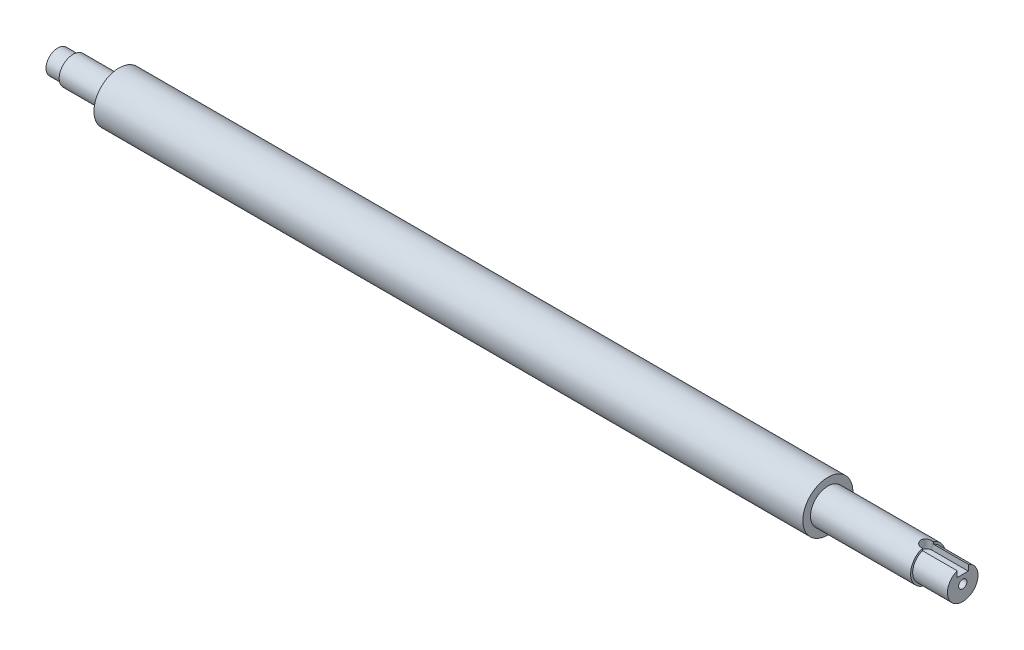
ISO-10303-21;
HEADER;
FILE_DESCRIPTION(('STEP AP214'),'2;1');
FILE_NAME('part.step','',(''),(''),'','','');
FILE_SCHEMA(('AUTOMOTIVE_DESIGN { 1 0 10303 214 1 1 1 1 }'));
ENDSEC;
DATA;
#1=APPLICATION_CONTEXT('core data for automotive mechanical design processes');
#2=APPLICATION_PROTOCOL_DEFINITION('international standard','automotive_design',2000,#1);
#3=PRODUCT_CONTEXT('',#1,'mechanical');
#4=PRODUCT('Part','Part','',(#3));
#5=PRODUCT_RELATED_PRODUCT_CATEGORY('part','',(#4));
#6=PRODUCT_DEFINITION_FORMATION('','',#4);
#7=PRODUCT_DEFINITION_CONTEXT('part definition',#1,'design');
#8=PRODUCT_DEFINITION('design','',#6,#7);
#9=PRODUCT_DEFINITION_SHAPE('','',#8);
#10=(LENGTH_UNIT() NAMED_UNIT(*) SI_UNIT(.MILLI.,.METRE.));
#11=(NAMED_UNIT(*) PLANE_ANGLE_UNIT() SI_UNIT($,.RADIAN.));
#12=(NAMED_UNIT(*) SI_UNIT($,.STERADIAN.) SOLID_ANGLE_UNIT());
#13=UNCERTAINTY_MEASURE_WITH_UNIT(LENGTH_MEASURE(1.E-05),#10,'distance_accuracy_value','');
#14=(GEOMETRIC_REPRESENTATION_CONTEXT(3) GLOBAL_UNCERTAINTY_ASSIGNED_CONTEXT((#13)) GLOBAL_UNIT_ASSIGNED_CONTEXT((#10,
#11,#12)) REPRESENTATION_CONTEXT('',''));
#15=CARTESIAN_POINT('',(0.,0.,0.));
#16=DIRECTION('',(0.,0.,1.));
#17=DIRECTION('',(1.,0.,0.));
#18=AXIS2_PLACEMENT_3D('',#15,#16,#17);
#19=CARTESIAN_POINT('',(254.240699987468,12.5000000000002,0.));
#20=DIRECTION('',(1.,0.,0.));
#21=DIRECTION('',(0.,1.,0.));
#22=AXIS2_PLACEMENT_3D('',#19,#20,#21);
#23=PLANE('',#22);
#24=DIRECTION('',(0.,-1.,0.));
#25=VECTOR('',#24,1.);
#26=CARTESIAN_POINT('',(254.240699987468,12.5000000000002,4.));
#27=LINE('',#26,#25);
#28=CARTESIAN_POINT('',(254.240699987468,11.8427192823272,4.));
#29=VERTEX_POINT('',#28);
#30=CARTESIAN_POINT('',(254.240699987468,10.2469507659598,4.));
#31=VERTEX_POINT('',#30);
#32=EDGE_CURVE('E120',#29,#31,#27,.T.);
#33=ORIENTED_EDGE('',*,*,#32,.F.);
#34=CARTESIAN_POINT('',(254.240699987468,0.,0.));
#35=DIRECTION('',(1.,0.,0.));
#36=DIRECTION('',(0.,1.,0.));
#37=AXIS2_PLACEMENT_3D('',#34,#35,#36);
#38=CIRCLE('',#37,12.5000000000001);
#39=CARTESIAN_POINT('',(254.240699987468,11.8427192823272,-4.));
#40=VERTEX_POINT('',#39);
#41=EDGE_CURVE('E148',#29,#40,#38,.T.);
#42=ORIENTED_EDGE('',*,*,#41,.T.);
#43=DIRECTION('',(0.,1.,0.));
#44=VECTOR('',#43,1.);
#45=CARTESIAN_POINT('',(254.240699987468,12.5000000000002,-4.));
#46=LINE('',#45,#44);
#47=CARTESIAN_POINT('',(254.240699987468,10.2469507659598,-4.));
#48=VERTEX_POINT('',#47);
#49=EDGE_CURVE('E115',#48,#40,#46,.T.);
#50=ORIENTED_EDGE('',*,*,#49,.F.);
#51=CARTESIAN_POINT('',(254.240699987468,0.,0.));
#52=DIRECTION('',(1.,0.,0.));
#53=DIRECTION('',(0.,1.,0.));
#54=AXIS2_PLACEMENT_3D('',#51,#52,#53);
#55=CIRCLE('',#54,11.0000000000001);
#56=EDGE_CURVE('E123',#31,#48,#55,.T.);
#57=ORIENTED_EDGE('',*,*,#56,.F.);
#58=EDGE_LOOP('',(#33,#42,#50,#57));
#59=FACE_BOUND('',#58,.T.);
#60=ADVANCED_FACE('F32',(#59),#23,.T.);
#61=CARTESIAN_POINT('',(279.240699987468,0.,0.));
#62=DIRECTION('',(1.,0.,0.));
#63=DIRECTION('',(0.,1.,0.));
#64=AXIS2_PLACEMENT_3D('',#61,#62,#63);
#65=CYLINDRICAL_SURFACE('',#64,12.5000000000001);
#66=DIRECTION('',(1.,0.,0.));
#67=VECTOR('',#66,1.);
#68=CARTESIAN_POINT('',(279.240699987468,11.8427192823272,4.));
#69=LINE('',#68,#67);
#70=CARTESIAN_POINT('',(253.217727506573,11.8427192823272,4.));
#71=VERTEX_POINT('',#70);
#72=EDGE_CURVE('E58',#71,#29,#69,.T.);
#73=ORIENTED_EDGE('',*,*,#72,.F.);
#74=CARTESIAN_POINT('',(253.217727506573,11.8427192823272,-4.));
#75=CARTESIAN_POINT('',(253.108327734611,11.842702736606,-4.00001410484613));
#76=CARTESIAN_POINT('',(252.998937296725,11.844234805237,-3.995512175201));
#77=CARTESIAN_POINT('',(252.780999265837,11.8502730910576,-3.97758606678449));
#78=CARTESIAN_POINT('',(252.672451468089,11.8547785613245,-3.96416412872571));
#79=CARTESIAN_POINT('',(252.457266475728,11.8666242076311,-3.9285572511943));
#80=CARTESIAN_POINT('',(252.350624810962,11.8739564736693,-3.90639676021451));
#81=CARTESIAN_POINT('',(252.139721868202,11.891216499379,-3.85353581488657));
#82=CARTESIAN_POINT('',(252.035460666416,11.9011443420202,-3.82283508754056));
#83=CARTESIAN_POINT('',(251.727422502295,11.9343840843198,-3.71831764495511));
#84=CARTESIAN_POINT('',(251.528090954505,11.9611699822068,-3.63203544139886));
#85=CARTESIAN_POINT('',(251.146714949531,12.020958395588,-3.42895021192286));
#86=CARTESIAN_POINT('',(250.964680127523,12.0539643457895,-3.31213030924908));
#87=CARTESIAN_POINT('',(250.616473517974,12.1237984078072,-3.04678507884789));
#88=CARTESIAN_POINT('',(250.451009182234,12.1607158548653,-2.89735303896513));
#89=CARTESIAN_POINT('',(250.147012657984,12.2334561140968,-2.57296449846115));
#90=CARTESIAN_POINT('',(250.008485158215,12.2692787347871,-2.39800356343232));
#91=CARTESIAN_POINT('',(249.759112308203,12.3368244653947,-2.02237003010512));
#92=CARTESIAN_POINT('',(249.649005550104,12.3684294972005,-1.82118394546976));
#93=CARTESIAN_POINT('',(249.464478011224,12.4229251649939,-1.40197197350369));
#94=CARTESIAN_POINT('',(249.390047032791,12.4458182908279,-1.18395091903582));
#95=CARTESIAN_POINT('',(249.281368642323,12.4796767811418,-0.744713961063375));
#96=CARTESIAN_POINT('',(249.245902573193,12.491003049934,-0.523827920101165));
#97=CARTESIAN_POINT('',(249.212294707531,12.5017287122875,-0.0789648151746442));
#98=CARTESIAN_POINT('',(249.214144773048,12.5011307063105,0.145011564197637));
#99=CARTESIAN_POINT('',(249.254326335844,12.488323667336,0.581094974437689));
#100=CARTESIAN_POINT('',(249.291335274552,12.476535580041,0.793338226675238));
#101=CARTESIAN_POINT('',(249.398608058179,12.4431945789582,1.2084232001272));
#102=CARTESIAN_POINT('',(249.468873714006,12.4216411334263,1.41126440871778));
#103=CARTESIAN_POINT('',(249.641485348809,12.3706364987477,1.80478548808182));
#104=CARTESIAN_POINT('',(249.744224026442,12.3410893067349,1.99528012693525));
#105=CARTESIAN_POINT('',(249.978556555618,12.2771965403046,2.35673113106227));
#106=CARTESIAN_POINT('',(250.110157712976,12.2428497517894,2.52768253275748));
#107=CARTESIAN_POINT('',(250.405174037865,12.1712409097158,2.85304511528218));
#108=CARTESIAN_POINT('',(250.569724209165,12.1339170352571,3.00641313381734));
#109=CARTESIAN_POINT('',(250.922699406658,12.0618172896258,3.28377291775699));
#110=CARTESIAN_POINT('',(251.111131765405,12.0270422062067,3.40775562728565));
#111=CARTESIAN_POINT('',(251.409098744322,11.9796198433083,3.56958208232607));
#112=CARTESIAN_POINT('',(251.511726565815,11.9645161845074,3.61975674493765));
#113=CARTESIAN_POINT('',(251.721132259325,11.9364591580625,3.71123075156255));
#114=CARTESIAN_POINT('',(251.82790839436,11.9235049021448,3.75253376401033));
#115=CARTESIAN_POINT('',(252.044740834465,11.9001802342951,3.82585831579177));
#116=CARTESIAN_POINT('',(252.154793484546,11.8898070557592,3.85788979915528));
#117=CARTESIAN_POINT('',(252.377422663521,11.8719756673205,3.91241790563964));
#118=CARTESIAN_POINT('',(252.489998010371,11.8645161211933,3.93491889994975));
#119=CARTESIAN_POINT('',(252.704966752434,11.8533815888389,3.96832908530803));
#120=CARTESIAN_POINT('',(252.807194922368,11.8493925948397,3.9802038456482));
#121=CARTESIAN_POINT('',(253.012188584606,11.8440568016294,3.99603937127681));
#122=CARTESIAN_POINT('',(253.114953144854,11.8427063770565,4.00001099551563));
#123=CARTESIAN_POINT('',(253.217727506573,11.8427192823272,4.));
#124=B_SPLINE_CURVE_WITH_KNOTS('',3,(#74,#75,#76,#77,#78,#79,#80,#81,#82,#83,#84,#85,#86,#87,
#88,#89,#90,#91,#92,#93,#94,#95,#96,#97,#98,#99,#100,#101,#102,#103,#104,#105,#106,#107,#108,
#109,#110,#111,#112,#113,#114,#115,#116,#117,#118,#119,#120,#121,#122,#123),.UNSPECIFIED.,.F.,
.F.,(4,2,2,2,2,2,2,2,2,2,2,2,2,2,2,2,2,2,2,2,2,2,2,2,4),(0.,0.328080176984111,0.656077971124907,
0.98316453936824,1.31026156448799,1.96355293984256,2.61720612481383,3.29209427898758,
3.96709980211697,4.65819584662372,5.34909422856991,6.01770820975084,6.68617638029993,
7.33045501553829,7.97476873730064,8.62719320105808,9.27978300073404,9.96076419384892,
10.6419549776068,10.9872862883783,11.3324745283028,11.6772911585125,12.0219494657669,
12.3305938648258,12.6388138912331),.UNSPECIFIED.);
#125=CARTESIAN_POINT('',(253.217727506573,11.8427192823272,-4.));
#126=VERTEX_POINT('',#125);
#127=EDGE_CURVE('E11',#126,#71,#124,.T.);
#128=ORIENTED_EDGE('',*,*,#127,.F.);
#129=DIRECTION('',(1.,0.,0.));
#130=VECTOR('',#129,1.);
#131=CARTESIAN_POINT('',(279.240699987468,11.8427192823272,-4.));
#132=LINE('',#131,#130);
#133=EDGE_CURVE('E117',#40,#126,#132,.F.);
#134=ORIENTED_EDGE('',*,*,#133,.F.);
#135=ORIENTED_EDGE('',*,*,#41,.F.);
#136=EDGE_LOOP('',(#73,#128,#134,#135));
#137=FACE_BOUND('',#136,.T.);
#138=CARTESIAN_POINT('',(182.240699987468,0.,0.));
#139=DIRECTION('',(1.,0.,0.));
#140=DIRECTION('',(0.,1.,0.));
#141=AXIS2_PLACEMENT_3D('',#138,#139,#140);
#142=CIRCLE('',#141,12.5000000000002);
#143=CARTESIAN_POINT('',(182.240699987468,12.5000000000002,0.));
#144=VERTEX_POINT('',#143);
#145=EDGE_CURVE('E145',#144,#144,#142,.T.);
#146=ORIENTED_EDGE('',*,*,#145,.T.);
#147=EDGE_LOOP('',(#146));
#148=FACE_BOUND('',#147,.T.);
#149=ADVANCED_FACE('F164',(#137,#148),#65,.T.);
#150=CARTESIAN_POINT('',(182.240699987468,18.,0.));
#151=DIRECTION('',(1.,0.,0.));
#152=DIRECTION('',(0.,1.,0.));
#153=AXIS2_PLACEMENT_3D('',#150,#151,#152);
#154=PLANE('',#153);
#155=CARTESIAN_POINT('',(182.240699987468,0.,0.));
#156=DIRECTION('',(1.,0.,0.));
#157=DIRECTION('',(0.,1.,0.));
#158=AXIS2_PLACEMENT_3D('',#155,#156,#157);
#159=CIRCLE('',#158,18.);
#160=CARTESIAN_POINT('',(182.240699987468,18.,0.));
#161=VERTEX_POINT('',#160);
#162=EDGE_CURVE('E142',#161,#161,#159,.T.);
#163=ORIENTED_EDGE('',*,*,#162,.T.);
#164=EDGE_LOOP('',(#163));
#165=FACE_BOUND('',#164,.T.);
#166=ORIENTED_EDGE('',*,*,#145,.F.);
#167=EDGE_LOOP('',(#166));
#168=FACE_BOUND('',#167,.T.);
#169=ADVANCED_FACE('F200',(#165,#168),#154,.T.);
#170=CARTESIAN_POINT('',(279.240699987468,0.,0.));
#171=DIRECTION('',(1.,0.,0.));
#172=DIRECTION('',(0.,1.,0.));
#173=AXIS2_PLACEMENT_3D('',#170,#171,#172);
#174=CYLINDRICAL_SURFACE('',#173,18.);
#175=CARTESIAN_POINT('',(-327.759300012532,0.,0.));
#176=DIRECTION('',(1.,0.,0.));
#177=DIRECTION('',(0.,1.,0.));
#178=AXIS2_PLACEMENT_3D('',#175,#176,#177);
#179=CIRCLE('',#178,18.);
#180=CARTESIAN_POINT('',(-327.759300012532,18.,0.));
#181=VERTEX_POINT('',#180);
#182=EDGE_CURVE('E139',#181,#181,#179,.T.);
#183=ORIENTED_EDGE('',*,*,#182,.T.);
#184=EDGE_LOOP('',(#183));
#185=FACE_BOUND('',#184,.T.);
#186=ORIENTED_EDGE('',*,*,#162,.F.);
#187=EDGE_LOOP('',(#186));
#188=FACE_BOUND('',#187,.T.);
#189=ADVANCED_FACE('F204',(#185,#188),#174,.T.);
#190=CARTESIAN_POINT('',(-327.759300012532,18.,0.));
#191=DIRECTION('',(-1.,0.,0.));
#192=DIRECTION('',(0.,-1.,0.));
#193=AXIS2_PLACEMENT_3D('',#190,#191,#192);
#194=PLANE('',#193);
#195=CARTESIAN_POINT('',(-327.759300012532,0.,0.));
#196=DIRECTION('',(1.,0.,0.));
#197=DIRECTION('',(0.,1.,0.));
#198=AXIS2_PLACEMENT_3D('',#195,#196,#197);
#199=CIRCLE('',#198,10.);
#200=CARTESIAN_POINT('',(-327.759300012532,9.99999999999996,0.));
#201=VERTEX_POINT('',#200);
#202=EDGE_CURVE('E136',#201,#201,#199,.T.);
#203=ORIENTED_EDGE('',*,*,#202,.T.);
#204=EDGE_LOOP('',(#203));
#205=FACE_BOUND('',#204,.T.);
#206=ORIENTED_EDGE('',*,*,#182,.F.);
#207=EDGE_LOOP('',(#206));
#208=FACE_BOUND('',#207,.T.);
#209=ADVANCED_FACE('F211',(#205,#208),#194,.T.);
#210=CARTESIAN_POINT('',(279.240699987468,0.,0.));
#211=DIRECTION('',(1.,0.,0.));
#212=DIRECTION('',(0.,1.,0.));
#213=AXIS2_PLACEMENT_3D('',#210,#211,#212);
#214=CYLINDRICAL_SURFACE('',#213,10.);
#215=CARTESIAN_POINT('',(-360.759300012532,0.,0.));
#216=DIRECTION('',(1.,0.,0.));
#217=DIRECTION('',(0.,1.,0.));
#218=AXIS2_PLACEMENT_3D('',#215,#216,#217);
#219=CIRCLE('',#218,10.);
#220=CARTESIAN_POINT('',(-360.759300012532,9.99999999999996,0.));
#221=VERTEX_POINT('',#220);
#222=EDGE_CURVE('E133',#221,#221,#219,.T.);
#223=ORIENTED_EDGE('',*,*,#222,.T.);
#224=EDGE_LOOP('',(#223));
#225=FACE_BOUND('',#224,.T.);
#226=ORIENTED_EDGE('',*,*,#202,.F.);
#227=EDGE_LOOP('',(#226));
#228=FACE_BOUND('',#227,.T.);
#229=ADVANCED_FACE('F215',(#225,#228),#214,.T.);
#230=CARTESIAN_POINT('',(-360.759300012532,9.99999999999996,0.));
#231=DIRECTION('',(-1.,0.,0.));
#232=DIRECTION('',(0.,-1.,0.));
#233=AXIS2_PLACEMENT_3D('',#230,#231,#232);
#234=PLANE('',#233);
#235=CARTESIAN_POINT('',(-360.759300012532,0.,0.));
#236=DIRECTION('',(1.,0.,0.));
#237=DIRECTION('',(0.,1.,0.));
#238=AXIS2_PLACEMENT_3D('',#235,#236,#237);
#239=CIRCLE('',#238,8.5);
#240=CARTESIAN_POINT('',(-360.759300012532,8.49999999999996,0.));
#241=VERTEX_POINT('',#240);
#242=EDGE_CURVE('E130',#241,#241,#239,.T.);
#243=ORIENTED_EDGE('',*,*,#242,.T.);
#244=EDGE_LOOP('',(#243));
#245=FACE_BOUND('',#244,.T.);
#246=ORIENTED_EDGE('',*,*,#222,.F.);
#247=EDGE_LOOP('',(#246));
#248=FACE_BOUND('',#247,.T.);
#249=ADVANCED_FACE('F219',(#245,#248),#234,.T.);
#250=CARTESIAN_POINT('',(279.240699987468,0.,0.));
#251=DIRECTION('',(1.,0.,0.));
#252=DIRECTION('',(0.,1.,0.));
#253=AXIS2_PLACEMENT_3D('',#250,#251,#252);
#254=CYLINDRICAL_SURFACE('',#253,8.5);
#255=CARTESIAN_POINT('',(-371.759300012532,0.,0.));
#256=DIRECTION('',(1.,0.,0.));
#257=DIRECTION('',(0.,1.,0.));
#258=AXIS2_PLACEMENT_3D('',#255,#256,#257);
#259=CIRCLE('',#258,8.5);
#260=CARTESIAN_POINT('',(-371.759300012532,8.49999999999995,0.));
#261=VERTEX_POINT('',#260);
#262=EDGE_CURVE('E127',#261,#261,#259,.T.);
#263=ORIENTED_EDGE('',*,*,#262,.T.);
#264=EDGE_LOOP('',(#263));
#265=FACE_BOUND('',#264,.T.);
#266=ORIENTED_EDGE('',*,*,#242,.F.);
#267=EDGE_LOOP('',(#266));
#268=FACE_BOUND('',#267,.T.);
#269=ADVANCED_FACE('F193',(#265,#268),#254,.T.);
#270=CARTESIAN_POINT('',(-371.759300012532,8.49999999999995,0.));
#271=DIRECTION('',(-1.,0.,0.));
#272=DIRECTION('',(0.,-1.,0.));
#273=AXIS2_PLACEMENT_3D('',#270,#271,#272);
#274=PLANE('',#273);
#275=ORIENTED_EDGE('',*,*,#262,.F.);
#276=EDGE_LOOP('',(#275));
#277=FACE_BOUND('',#276,.T.);
#278=ADVANCED_FACE('F186',(#277),#274,.T.);
#279=CARTESIAN_POINT('',(279.240699987468,11.0000000000002,0.));
#280=DIRECTION('',(1.,0.,0.));
#281=DIRECTION('',(0.,1.,0.));
#282=AXIS2_PLACEMENT_3D('',#279,#280,#281);
#283=PLANE('',#282);
#284=CARTESIAN_POINT('',(279.240699987468,0.,0.));
#285=DIRECTION('',(1.,0.,0.));
#286=DIRECTION('',(0.,1.,0.));
#287=AXIS2_PLACEMENT_3D('',#284,#285,#286);
#288=CIRCLE('',#287,3.);
#289=CARTESIAN_POINT('',(279.240699987468,3.00000000000003,0.));
#290=VERTEX_POINT('',#289);
#291=EDGE_CURVE('E171',#290,#290,#288,.T.);
#292=ORIENTED_EDGE('',*,*,#291,.F.);
#293=EDGE_LOOP('',(#292));
#294=FACE_BOUND('',#293,.T.);
#295=DIRECTION('',(0.,1.,0.));
#296=VECTOR('',#295,1.);
#297=CARTESIAN_POINT('',(279.240699987468,6.,4.));
#298=LINE('',#297,#296);
#299=CARTESIAN_POINT('',(279.240699987468,6.,4.));
#300=VERTEX_POINT('',#299);
#301=CARTESIAN_POINT('',(279.240699987468,10.2469507659598,4.));
#302=VERTEX_POINT('',#301);
#303=EDGE_CURVE('E118',#300,#302,#298,.T.);
#304=ORIENTED_EDGE('',*,*,#303,.T.);
#305=CARTESIAN_POINT('',(279.240699987468,0.,0.));
#306=DIRECTION('',(1.,0.,0.));
#307=DIRECTION('',(0.,1.,0.));
#308=AXIS2_PLACEMENT_3D('',#305,#306,#307);
#309=CIRCLE('',#308,11.0000000000001);
#310=CARTESIAN_POINT('',(279.240699987468,10.2469507659598,-4.));
#311=VERTEX_POINT('',#310);
#312=EDGE_CURVE('E108',#302,#311,#309,.T.);
#313=ORIENTED_EDGE('',*,*,#312,.T.);
#314=DIRECTION('',(0.,1.,0.));
#315=VECTOR('',#314,1.);
#316=CARTESIAN_POINT('',(279.240699987468,6.,-4.));
#317=LINE('',#316,#315);
#318=CARTESIAN_POINT('',(279.240699987468,6.,-4.));
#319=VERTEX_POINT('',#318);
#320=EDGE_CURVE('E50',#319,#311,#317,.T.);
#321=ORIENTED_EDGE('',*,*,#320,.F.);
#322=DIRECTION('',(0.,0.,1.));
#323=VECTOR('',#322,1.);
#324=CARTESIAN_POINT('',(279.240699987468,6.,0.));
#325=LINE('',#324,#323);
#326=EDGE_CURVE('E43',#319,#300,#325,.T.);
#327=ORIENTED_EDGE('',*,*,#326,.T.);
#328=EDGE_LOOP('',(#304,#313,#321,#327));
#329=FACE_BOUND('',#328,.T.);
#330=ADVANCED_FACE('F106',(#294,#329),#283,.T.);
#331=CARTESIAN_POINT('',(279.240699987468,0.,0.));
#332=DIRECTION('',(1.,0.,0.));
#333=DIRECTION('',(0.,1.,0.));
#334=AXIS2_PLACEMENT_3D('',#331,#332,#333);
#335=CYLINDRICAL_SURFACE('',#334,11.0000000000001);
#336=DIRECTION('',(1.,0.,0.));
#337=VECTOR('',#336,1.);
#338=CARTESIAN_POINT('',(279.240699987468,10.2469507659598,4.));
#339=LINE('',#338,#337);
#340=EDGE_CURVE('E97',#31,#302,#339,.T.);
#341=ORIENTED_EDGE('',*,*,#340,.F.);
#342=ORIENTED_EDGE('',*,*,#56,.T.);
#343=DIRECTION('',(1.,0.,0.));
#344=VECTOR('',#343,1.);
#345=CARTESIAN_POINT('',(279.240699987468,10.2469507659598,-4.));
#346=LINE('',#345,#344);
#347=EDGE_CURVE('E151',#311,#48,#346,.F.);
#348=ORIENTED_EDGE('',*,*,#347,.F.);
#349=ORIENTED_EDGE('',*,*,#312,.F.);
#350=EDGE_LOOP('',(#341,#342,#348,#349));
#351=FACE_BOUND('',#350,.T.);
#352=ADVANCED_FACE('F158',(#351),#335,.T.);
#353=CARTESIAN_POINT('',(279.240699987468,6.,4.));
#354=DIRECTION('',(0.,0.,1.));
#355=DIRECTION('',(1.,0.,0.));
#356=AXIS2_PLACEMENT_3D('',#353,#354,#355);
#357=PLANE('',#356);
#358=ORIENTED_EDGE('',*,*,#72,.T.);
#359=ORIENTED_EDGE('',*,*,#32,.T.);
#360=ORIENTED_EDGE('',*,*,#340,.T.);
#361=ORIENTED_EDGE('',*,*,#303,.F.);
#362=DIRECTION('',(1.,0.,0.));
#363=VECTOR('',#362,1.);
#364=CARTESIAN_POINT('',(279.240699987468,6.,4.));
#365=LINE('',#364,#363);
#366=CARTESIAN_POINT('',(253.217727506573,6.,4.));
#367=VERTEX_POINT('',#366);
#368=EDGE_CURVE('E94',#367,#300,#365,.T.);
#369=ORIENTED_EDGE('',*,*,#368,.F.);
#370=DIRECTION('',(0.,1.,0.));
#371=VECTOR('',#370,1.);
#372=CARTESIAN_POINT('',(253.217727506573,6.,4.));
#373=LINE('',#372,#371);
#374=EDGE_CURVE('E110',#367,#71,#373,.T.);
#375=ORIENTED_EDGE('',*,*,#374,.T.);
#376=EDGE_LOOP('',(#358,#359,#360,#361,#369,#375));
#377=FACE_BOUND('',#376,.T.);
#378=ADVANCED_FACE('F154',(#377),#357,.F.);
#379=CARTESIAN_POINT('',(253.217727506573,6.,0.));
#380=DIRECTION('',(0.,1.,0.));
#381=DIRECTION('',(0.,0.,1.));
#382=AXIS2_PLACEMENT_3D('',#379,#380,#381);
#383=CYLINDRICAL_SURFACE('',#382,4.);
#384=ORIENTED_EDGE('',*,*,#127,.T.);
#385=ORIENTED_EDGE('',*,*,#374,.F.);
#386=CARTESIAN_POINT('',(253.217727506573,6.,0.));
#387=DIRECTION('',(0.,1.,0.));
#388=DIRECTION('',(0.,0.,1.));
#389=AXIS2_PLACEMENT_3D('',#386,#387,#388);
#390=CIRCLE('',#389,4.);
#391=CARTESIAN_POINT('',(253.217727506573,6.,-4.));
#392=VERTEX_POINT('',#391);
#393=EDGE_CURVE('E102',#392,#367,#390,.T.);
#394=ORIENTED_EDGE('',*,*,#393,.F.);
#395=DIRECTION('',(0.,1.,0.));
#396=VECTOR('',#395,1.);
#397=CARTESIAN_POINT('',(253.217727506573,6.,-4.));
#398=LINE('',#397,#396);
#399=EDGE_CURVE('E100',#392,#126,#398,.T.);
#400=ORIENTED_EDGE('',*,*,#399,.T.);
#401=EDGE_LOOP('',(#384,#385,#394,#400));
#402=FACE_BOUND('',#401,.T.);
#403=ADVANCED_FACE('F168',(#402),#383,.F.);
#404=CARTESIAN_POINT('',(279.240699987468,6.,-4.));
#405=DIRECTION('',(0.,0.,-1.));
#406=DIRECTION('',(-1.,0.,0.));
#407=AXIS2_PLACEMENT_3D('',#404,#405,#406);
#408=PLANE('',#407);
#409=ORIENTED_EDGE('',*,*,#133,.T.);
#410=ORIENTED_EDGE('',*,*,#399,.F.);
#411=DIRECTION('',(-1.,0.,0.));
#412=VECTOR('',#411,1.);
#413=CARTESIAN_POINT('',(279.240699987468,6.,-4.));
#414=LINE('',#413,#412);
#415=EDGE_CURVE('E92',#319,#392,#414,.T.);
#416=ORIENTED_EDGE('',*,*,#415,.F.);
#417=ORIENTED_EDGE('',*,*,#320,.T.);
#418=ORIENTED_EDGE('',*,*,#347,.T.);
#419=ORIENTED_EDGE('',*,*,#49,.T.);
#420=EDGE_LOOP('',(#409,#410,#416,#417,#418,#419));
#421=FACE_BOUND('',#420,.T.);
#422=ADVANCED_FACE('F98',(#421),#408,.F.);
#423=CARTESIAN_POINT('',(279.240699987468,6.,0.));
#424=DIRECTION('',(0.,1.,0.));
#425=DIRECTION('',(0.,0.,1.));
#426=AXIS2_PLACEMENT_3D('',#423,#424,#425);
#427=PLANE('',#426);
#428=ORIENTED_EDGE('',*,*,#415,.T.);
#429=ORIENTED_EDGE('',*,*,#393,.T.);
#430=ORIENTED_EDGE('',*,*,#368,.T.);
#431=ORIENTED_EDGE('',*,*,#326,.F.);
#432=EDGE_LOOP('',(#428,#429,#430,#431));
#433=FACE_BOUND('',#432,.T.);
#434=ADVANCED_FACE('F90',(#433),#427,.T.);
#435=CARTESIAN_POINT('',(254.240699987468,0.,0.));
#436=DIRECTION('',(1.,0.,0.));
#437=DIRECTION('',(0.,1.,0.));
#438=AXIS2_PLACEMENT_3D('',#435,#436,#437);
#439=CYLINDRICAL_SURFACE('',#438,3.);
#440=CARTESIAN_POINT('',(254.240699987468,0.,0.));
#441=DIRECTION('',(1.,0.,0.));
#442=DIRECTION('',(0.,1.,0.));
#443=AXIS2_PLACEMENT_3D('',#440,#441,#442);
#444=CIRCLE('',#443,3.);
#445=CARTESIAN_POINT('',(254.240699987468,3.00000000000003,0.));
#446=VERTEX_POINT('',#445);
#447=EDGE_CURVE('E103',#446,#446,#444,.T.);
#448=ORIENTED_EDGE('',*,*,#447,.F.);
#449=EDGE_LOOP('',(#448));
#450=FACE_BOUND('',#449,.T.);
#451=ORIENTED_EDGE('',*,*,#291,.T.);
#452=EDGE_LOOP('',(#451));
#453=FACE_BOUND('',#452,.T.);
#454=ADVANCED_FACE('F179',(#450,#453),#439,.F.);
#455=CARTESIAN_POINT('',(254.240699987468,0.,0.));
#456=DIRECTION('',(1.,0.,0.));
#457=DIRECTION('',(0.,1.,0.));
#458=AXIS2_PLACEMENT_3D('',#455,#456,#457);
#459=PLANE('',#458);
#460=ORIENTED_EDGE('',*,*,#447,.T.);
#461=EDGE_LOOP('',(#460));
#462=FACE_BOUND('',#461,.T.);
#463=ADVANCED_FACE('F177',(#462),#459,.T.);
#464=CLOSED_SHELL('',(#60,#149,#169,#189,#209,#229,#249,#269,#278,#330,#352,#378,#403,#422,#434,
#454,#463));
#465=MANIFOLD_SOLID_BREP('B2',#464);
#466=ADVANCED_BREP_SHAPE_REPRESENTATION('',(#18,#465),#14);
#467=SHAPE_DEFINITION_REPRESENTATION(#9,#466);
ENDSEC;
END-ISO-10303-21;
